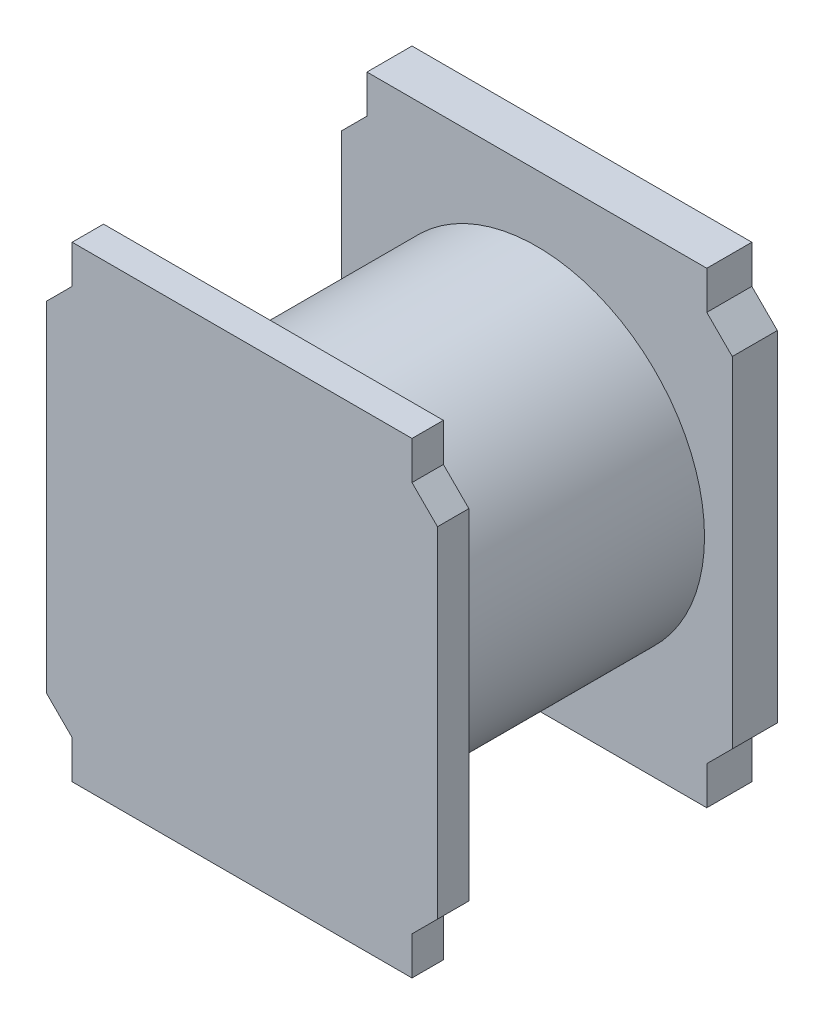
ISO-10303-21;
HEADER;
FILE_DESCRIPTION(('STEP AP214'),'2;1');
FILE_NAME('part.step','',(''),(''),'','','');
FILE_SCHEMA(('AUTOMOTIVE_DESIGN { 1 0 10303 214 1 1 1 1 }'));
ENDSEC;
DATA;
#1=APPLICATION_CONTEXT('core data for automotive mechanical design processes');
#2=APPLICATION_PROTOCOL_DEFINITION('international standard','automotive_design',2000,#1);
#3=PRODUCT_CONTEXT('',#1,'mechanical');
#4=PRODUCT('Part','Part','',(#3));
#5=PRODUCT_RELATED_PRODUCT_CATEGORY('part','',(#4));
#6=PRODUCT_DEFINITION_FORMATION('','',#4);
#7=PRODUCT_DEFINITION_CONTEXT('part definition',#1,'design');
#8=PRODUCT_DEFINITION('design','',#6,#7);
#9=PRODUCT_DEFINITION_SHAPE('','',#8);
#10=(LENGTH_UNIT() NAMED_UNIT(*) SI_UNIT(.MILLI.,.METRE.));
#11=(NAMED_UNIT(*) PLANE_ANGLE_UNIT() SI_UNIT($,.RADIAN.));
#12=(NAMED_UNIT(*) SI_UNIT($,.STERADIAN.) SOLID_ANGLE_UNIT());
#13=UNCERTAINTY_MEASURE_WITH_UNIT(LENGTH_MEASURE(1.E-05),#10,'distance_accuracy_value','');
#14=(GEOMETRIC_REPRESENTATION_CONTEXT(3) GLOBAL_UNCERTAINTY_ASSIGNED_CONTEXT((#13)) GLOBAL_UNIT_ASSIGNED_CONTEXT((#10,
#11,#12)) REPRESENTATION_CONTEXT('',''));
#15=CARTESIAN_POINT('',(0.,0.,0.));
#16=DIRECTION('',(0.,0.,1.));
#17=DIRECTION('',(1.,0.,0.));
#18=AXIS2_PLACEMENT_3D('',#15,#16,#17);
#19=CARTESIAN_POINT('',(0.,0.,4.));
#20=DIRECTION('',(0.,0.,1.));
#21=DIRECTION('',(1.,0.,0.));
#22=AXIS2_PLACEMENT_3D('',#19,#20,#21);
#23=PLANE('',#22);
#24=DIRECTION('',(0.,1.,0.));
#25=VECTOR('',#24,1.);
#26=CARTESIAN_POINT('',(-2.,2.299999999995,4.));
#27=LINE('',#26,#25);
#28=CARTESIAN_POINT('',(-2.,2.299999999995,4.));
#29=VERTEX_POINT('',#28);
#30=CARTESIAN_POINT('',(-2.,2.75,4.));
#31=VERTEX_POINT('',#30);
#32=EDGE_CURVE('E11',#29,#31,#27,.T.);
#33=ORIENTED_EDGE('',*,*,#32,.F.);
#34=DIRECTION('',(0.707106781193048,0.707106781180048,0.));
#35=VECTOR('',#34,1.);
#36=CARTESIAN_POINT('',(-2.3,2.,4.));
#37=LINE('',#36,#35);
#38=CARTESIAN_POINT('',(-2.3,2.,4.));
#39=VERTEX_POINT('',#38);
#40=EDGE_CURVE('E253',#39,#29,#37,.T.);
#41=ORIENTED_EDGE('',*,*,#40,.F.);
#42=DIRECTION('',(0.,1.,0.));
#43=VECTOR('',#42,1.);
#44=CARTESIAN_POINT('',(-2.3,-2.,4.));
#45=LINE('',#44,#43);
#46=CARTESIAN_POINT('',(-2.3,-2.,4.));
#47=VERTEX_POINT('',#46);
#48=EDGE_CURVE('E246',#47,#39,#45,.T.);
#49=ORIENTED_EDGE('',*,*,#48,.F.);
#50=DIRECTION('',(-0.707106781193048,0.707106781180048,0.));
#51=VECTOR('',#50,1.);
#52=CARTESIAN_POINT('',(-2.,-2.299999999995,4.));
#53=LINE('',#52,#51);
#54=CARTESIAN_POINT('',(-2.,-2.299999999995,4.));
#55=VERTEX_POINT('',#54);
#56=EDGE_CURVE('E214',#55,#47,#53,.T.);
#57=ORIENTED_EDGE('',*,*,#56,.F.);
#58=DIRECTION('',(0.,1.,0.));
#59=VECTOR('',#58,1.);
#60=CARTESIAN_POINT('',(-2.,-2.75,4.));
#61=LINE('',#60,#59);
#62=CARTESIAN_POINT('',(-2.,-2.75,4.));
#63=VERTEX_POINT('',#62);
#64=EDGE_CURVE('E208',#63,#55,#61,.T.);
#65=ORIENTED_EDGE('',*,*,#64,.F.);
#66=DIRECTION('',(-1.,0.,0.));
#67=VECTOR('',#66,1.);
#68=CARTESIAN_POINT('',(2.,-2.75,4.));
#69=LINE('',#68,#67);
#70=CARTESIAN_POINT('',(2.,-2.75,4.));
#71=VERTEX_POINT('',#70);
#72=EDGE_CURVE('E211',#71,#63,#69,.T.);
#73=ORIENTED_EDGE('',*,*,#72,.F.);
#74=DIRECTION('',(0.,-1.,0.));
#75=VECTOR('',#74,1.);
#76=CARTESIAN_POINT('',(2.,-2.299999999995,4.));
#77=LINE('',#76,#75);
#78=CARTESIAN_POINT('',(2.,-2.299999999995,4.));
#79=VERTEX_POINT('',#78);
#80=EDGE_CURVE('E238',#79,#71,#77,.T.);
#81=ORIENTED_EDGE('',*,*,#80,.F.);
#82=DIRECTION('',(-0.707106781193048,-0.707106781180048,0.));
#83=VECTOR('',#82,1.);
#84=CARTESIAN_POINT('',(2.3,-2.,4.));
#85=LINE('',#84,#83);
#86=CARTESIAN_POINT('',(2.3,-2.,4.));
#87=VERTEX_POINT('',#86);
#88=EDGE_CURVE('E348',#87,#79,#85,.T.);
#89=ORIENTED_EDGE('',*,*,#88,.F.);
#90=DIRECTION('',(0.,-1.,0.));
#91=VECTOR('',#90,1.);
#92=CARTESIAN_POINT('',(2.3,2.,4.));
#93=LINE('',#92,#91);
#94=CARTESIAN_POINT('',(2.3,2.,4.));
#95=VERTEX_POINT('',#94);
#96=EDGE_CURVE('E340',#95,#87,#93,.T.);
#97=ORIENTED_EDGE('',*,*,#96,.F.);
#98=DIRECTION('',(0.707106781193048,-0.707106781180048,0.));
#99=VECTOR('',#98,1.);
#100=CARTESIAN_POINT('',(2.,2.299999999995,4.));
#101=LINE('',#100,#99);
#102=CARTESIAN_POINT('',(2.,2.299999999995,4.));
#103=VERTEX_POINT('',#102);
#104=EDGE_CURVE('E332',#103,#95,#101,.T.);
#105=ORIENTED_EDGE('',*,*,#104,.F.);
#106=DIRECTION('',(0.,-1.,0.));
#107=VECTOR('',#106,1.);
#108=CARTESIAN_POINT('',(2.,2.75,4.));
#109=LINE('',#108,#107);
#110=CARTESIAN_POINT('',(2.,2.75,4.));
#111=VERTEX_POINT('',#110);
#112=EDGE_CURVE('E371',#111,#103,#109,.T.);
#113=ORIENTED_EDGE('',*,*,#112,.F.);
#114=DIRECTION('',(1.,0.,0.));
#115=VECTOR('',#114,1.);
#116=CARTESIAN_POINT('',(-2.,2.75,4.));
#117=LINE('',#116,#115);
#118=EDGE_CURVE('E329',#31,#111,#117,.T.);
#119=ORIENTED_EDGE('',*,*,#118,.F.);
#120=EDGE_LOOP('',(#33,#41,#49,#57,#65,#73,#81,#89,#97,#105,#113,#119));
#121=FACE_BOUND('',#120,.T.);
#122=ADVANCED_FACE('F17',(#121),#23,.T.);
#123=CARTESIAN_POINT('',(-2.,2.299999999995,0.));
#124=DIRECTION('',(-1.,0.,0.));
#125=DIRECTION('',(0.,0.,1.));
#126=AXIS2_PLACEMENT_3D('',#123,#124,#125);
#127=PLANE('',#126);
#128=DIRECTION('',(0.,1.,0.));
#129=VECTOR('',#128,1.);
#130=CARTESIAN_POINT('',(-2.,1.149999999997,3.630577));
#131=LINE('',#130,#129);
#132=CARTESIAN_POINT('',(-2.,2.299999999995,3.630577));
#133=VERTEX_POINT('',#132);
#134=CARTESIAN_POINT('',(-2.,2.75,3.630577));
#135=VERTEX_POINT('',#134);
#136=EDGE_CURVE('E318',#133,#135,#131,.T.);
#137=ORIENTED_EDGE('',*,*,#136,.F.);
#138=DIRECTION('',(0.,0.,1.));
#139=VECTOR('',#138,1.);
#140=CARTESIAN_POINT('',(-2.,2.299999999995,0.));
#141=LINE('',#140,#139);
#142=EDGE_CURVE('E27',#133,#29,#141,.T.);
#143=ORIENTED_EDGE('',*,*,#142,.T.);
#144=ORIENTED_EDGE('',*,*,#32,.T.);
#145=DIRECTION('',(0.,0.,1.));
#146=VECTOR('',#145,1.);
#147=CARTESIAN_POINT('',(-2.,2.75,0.));
#148=LINE('',#147,#146);
#149=EDGE_CURVE('E326',#135,#31,#148,.T.);
#150=ORIENTED_EDGE('',*,*,#149,.F.);
#151=EDGE_LOOP('',(#137,#143,#144,#150));
#152=FACE_BOUND('',#151,.T.);
#153=ADVANCED_FACE('F569',(#152),#127,.T.);
#154=CARTESIAN_POINT('',(-2.3,2.,0.));
#155=DIRECTION('',(-0.707106781180048,0.707106781193048,0.));
#156=DIRECTION('',(0.,0.,1.));
#157=AXIS2_PLACEMENT_3D('',#154,#155,#156);
#158=PLANE('',#157);
#159=DIRECTION('',(0.707106781193048,0.707106781180048,0.));
#160=VECTOR('',#159,1.);
#161=CARTESIAN_POINT('',(-2.22499999999,2.075000000009,3.630577));
#162=LINE('',#161,#160);
#163=CARTESIAN_POINT('',(-2.3,2.,3.630577));
#164=VERTEX_POINT('',#163);
#165=EDGE_CURVE('E320',#164,#133,#162,.T.);
#166=ORIENTED_EDGE('',*,*,#165,.F.);
#167=DIRECTION('',(0.,0.,1.));
#168=VECTOR('',#167,1.);
#169=CARTESIAN_POINT('',(-2.3,2.,0.));
#170=LINE('',#169,#168);
#171=EDGE_CURVE('E247',#164,#39,#170,.T.);
#172=ORIENTED_EDGE('',*,*,#171,.T.);
#173=ORIENTED_EDGE('',*,*,#40,.T.);
#174=ORIENTED_EDGE('',*,*,#142,.F.);
#175=EDGE_LOOP('',(#166,#172,#173,#174));
#176=FACE_BOUND('',#175,.T.);
#177=ADVANCED_FACE('F575',(#176),#158,.T.);
#178=CARTESIAN_POINT('',(-2.3,-2.,0.));
#179=DIRECTION('',(-1.,0.,0.));
#180=DIRECTION('',(0.,0.,1.));
#181=AXIS2_PLACEMENT_3D('',#178,#179,#180);
#182=PLANE('',#181);
#183=DIRECTION('',(0.,1.,0.));
#184=VECTOR('',#183,1.);
#185=CARTESIAN_POINT('',(-2.3,-1.,3.630577));
#186=LINE('',#185,#184);
#187=CARTESIAN_POINT('',(-2.3,-2.,3.630577));
#188=VERTEX_POINT('',#187);
#189=EDGE_CURVE('E311',#188,#164,#186,.T.);
#190=ORIENTED_EDGE('',*,*,#189,.F.);
#191=DIRECTION('',(0.,0.,1.));
#192=VECTOR('',#191,1.);
#193=CARTESIAN_POINT('',(-2.3,-2.,0.));
#194=LINE('',#193,#192);
#195=EDGE_CURVE('E245',#188,#47,#194,.T.);
#196=ORIENTED_EDGE('',*,*,#195,.T.);
#197=ORIENTED_EDGE('',*,*,#48,.T.);
#198=ORIENTED_EDGE('',*,*,#171,.F.);
#199=EDGE_LOOP('',(#190,#196,#197,#198));
#200=FACE_BOUND('',#199,.T.);
#201=ADVANCED_FACE('F573',(#200),#182,.T.);
#202=CARTESIAN_POINT('',(-2.,-2.299999999995,0.));
#203=DIRECTION('',(-0.707106781180048,-0.707106781193048,0.));
#204=DIRECTION('',(-0.707106781193048,0.707106781180048,0.));
#205=AXIS2_PLACEMENT_3D('',#202,#203,#204);
#206=PLANE('',#205);
#207=DIRECTION('',(-0.707106781193048,0.707106781180048,0.));
#208=VECTOR('',#207,1.);
#209=CARTESIAN_POINT('',(-2.07499999999,-2.225000000006,3.630577));
#210=LINE('',#209,#208);
#211=CARTESIAN_POINT('',(-2.,-2.299999999995,3.630577));
#212=VERTEX_POINT('',#211);
#213=EDGE_CURVE('E310',#212,#188,#210,.T.);
#214=ORIENTED_EDGE('',*,*,#213,.F.);
#215=DIRECTION('',(0.,0.,1.));
#216=VECTOR('',#215,1.);
#217=CARTESIAN_POINT('',(-2.,-2.299999999995,0.));
#218=LINE('',#217,#216);
#219=EDGE_CURVE('E218',#212,#55,#218,.T.);
#220=ORIENTED_EDGE('',*,*,#219,.T.);
#221=ORIENTED_EDGE('',*,*,#56,.T.);
#222=ORIENTED_EDGE('',*,*,#195,.F.);
#223=EDGE_LOOP('',(#214,#220,#221,#222));
#224=FACE_BOUND('',#223,.T.);
#225=ADVANCED_FACE('F563',(#224),#206,.T.);
#226=CARTESIAN_POINT('',(-2.,-2.75,0.));
#227=DIRECTION('',(-1.,0.,0.));
#228=DIRECTION('',(0.,0.,1.));
#229=AXIS2_PLACEMENT_3D('',#226,#227,#228);
#230=PLANE('',#229);
#231=DIRECTION('',(0.,1.,0.));
#232=VECTOR('',#231,1.);
#233=CARTESIAN_POINT('',(-2.,-1.375,3.630577));
#234=LINE('',#233,#232);
#235=CARTESIAN_POINT('',(-2.,-2.75,3.630577));
#236=VERTEX_POINT('',#235);
#237=EDGE_CURVE('E223',#236,#212,#234,.T.);
#238=ORIENTED_EDGE('',*,*,#237,.F.);
#239=DIRECTION('',(0.,0.,1.));
#240=VECTOR('',#239,1.);
#241=CARTESIAN_POINT('',(-2.,-2.75,0.));
#242=LINE('',#241,#240);
#243=EDGE_CURVE('E219',#236,#63,#242,.T.);
#244=ORIENTED_EDGE('',*,*,#243,.T.);
#245=ORIENTED_EDGE('',*,*,#64,.T.);
#246=ORIENTED_EDGE('',*,*,#219,.F.);
#247=EDGE_LOOP('',(#238,#244,#245,#246));
#248=FACE_BOUND('',#247,.T.);
#249=ADVANCED_FACE('F224',(#248),#230,.T.);
#250=CARTESIAN_POINT('',(2.,-2.75,0.));
#251=DIRECTION('',(0.,-1.,0.));
#252=DIRECTION('',(0.,0.,-1.));
#253=AXIS2_PLACEMENT_3D('',#250,#251,#252);
#254=PLANE('',#253);
#255=DIRECTION('',(-1.,0.,0.));
#256=VECTOR('',#255,1.);
#257=CARTESIAN_POINT('',(1.,-2.75,3.630577));
#258=LINE('',#257,#256);
#259=CARTESIAN_POINT('',(2.,-2.75,3.630577));
#260=VERTEX_POINT('',#259);
#261=EDGE_CURVE('E303',#260,#236,#258,.T.);
#262=ORIENTED_EDGE('',*,*,#261,.F.);
#263=DIRECTION('',(0.,0.,1.));
#264=VECTOR('',#263,1.);
#265=CARTESIAN_POINT('',(2.,-2.75,0.));
#266=LINE('',#265,#264);
#267=EDGE_CURVE('E235',#260,#71,#266,.T.);
#268=ORIENTED_EDGE('',*,*,#267,.T.);
#269=ORIENTED_EDGE('',*,*,#72,.T.);
#270=ORIENTED_EDGE('',*,*,#243,.F.);
#271=EDGE_LOOP('',(#262,#268,#269,#270));
#272=FACE_BOUND('',#271,.T.);
#273=ADVANCED_FACE('F231',(#272),#254,.T.);
#274=CARTESIAN_POINT('',(2.,-2.299999999995,0.));
#275=DIRECTION('',(1.,0.,0.));
#276=DIRECTION('',(0.,1.,0.));
#277=AXIS2_PLACEMENT_3D('',#274,#275,#276);
#278=PLANE('',#277);
#279=DIRECTION('',(0.,-1.,0.));
#280=VECTOR('',#279,1.);
#281=CARTESIAN_POINT('',(2.,-1.149999999997,3.630577));
#282=LINE('',#281,#280);
#283=CARTESIAN_POINT('',(2.,-2.299999999995,3.630577));
#284=VERTEX_POINT('',#283);
#285=EDGE_CURVE('E298',#284,#260,#282,.T.);
#286=ORIENTED_EDGE('',*,*,#285,.F.);
#287=DIRECTION('',(0.,0.,1.));
#288=VECTOR('',#287,1.);
#289=CARTESIAN_POINT('',(2.,-2.299999999995,0.));
#290=LINE('',#289,#288);
#291=EDGE_CURVE('E308',#284,#79,#290,.T.);
#292=ORIENTED_EDGE('',*,*,#291,.T.);
#293=ORIENTED_EDGE('',*,*,#80,.T.);
#294=ORIENTED_EDGE('',*,*,#267,.F.);
#295=EDGE_LOOP('',(#286,#292,#293,#294));
#296=FACE_BOUND('',#295,.T.);
#297=ADVANCED_FACE('F356',(#296),#278,.T.);
#298=CARTESIAN_POINT('',(2.3,-2.,0.));
#299=DIRECTION('',(0.707106781180048,-0.707106781193048,0.));
#300=DIRECTION('',(0.,0.,-1.));
#301=AXIS2_PLACEMENT_3D('',#298,#299,#300);
#302=PLANE('',#301);
#303=DIRECTION('',(-0.707106781193048,-0.707106781180048,0.));
#304=VECTOR('',#303,1.);
#305=CARTESIAN_POINT('',(2.22499999999,-2.075000000009,3.630577));
#306=LINE('',#305,#304);
#307=CARTESIAN_POINT('',(2.3,-2.,3.630577));
#308=VERTEX_POINT('',#307);
#309=EDGE_CURVE('E294',#308,#284,#306,.T.);
#310=ORIENTED_EDGE('',*,*,#309,.F.);
#311=DIRECTION('',(0.,0.,1.));
#312=VECTOR('',#311,1.);
#313=CARTESIAN_POINT('',(2.3,-2.,0.));
#314=LINE('',#313,#312);
#315=EDGE_CURVE('E342',#308,#87,#314,.T.);
#316=ORIENTED_EDGE('',*,*,#315,.T.);
#317=ORIENTED_EDGE('',*,*,#88,.T.);
#318=ORIENTED_EDGE('',*,*,#291,.F.);
#319=EDGE_LOOP('',(#310,#316,#317,#318));
#320=FACE_BOUND('',#319,.T.);
#321=ADVANCED_FACE('F357',(#320),#302,.T.);
#322=CARTESIAN_POINT('',(2.3,2.,0.));
#323=DIRECTION('',(1.,0.,0.));
#324=DIRECTION('',(0.,1.,0.));
#325=AXIS2_PLACEMENT_3D('',#322,#323,#324);
#326=PLANE('',#325);
#327=DIRECTION('',(0.,-1.,0.));
#328=VECTOR('',#327,1.);
#329=CARTESIAN_POINT('',(2.3,1.,3.630577));
#330=LINE('',#329,#328);
#331=CARTESIAN_POINT('',(2.3,2.,3.630577));
#332=VERTEX_POINT('',#331);
#333=EDGE_CURVE('E295',#332,#308,#330,.T.);
#334=ORIENTED_EDGE('',*,*,#333,.F.);
#335=DIRECTION('',(0.,0.,1.));
#336=VECTOR('',#335,1.);
#337=CARTESIAN_POINT('',(2.3,2.,0.));
#338=LINE('',#337,#336);
#339=EDGE_CURVE('E333',#332,#95,#338,.T.);
#340=ORIENTED_EDGE('',*,*,#339,.T.);
#341=ORIENTED_EDGE('',*,*,#96,.T.);
#342=ORIENTED_EDGE('',*,*,#315,.F.);
#343=EDGE_LOOP('',(#334,#340,#341,#342));
#344=FACE_BOUND('',#343,.T.);
#345=ADVANCED_FACE('F361',(#344),#326,.T.);
#346=CARTESIAN_POINT('',(2.,2.299999999995,0.));
#347=DIRECTION('',(0.707106781180048,0.707106781193048,0.));
#348=DIRECTION('',(0.,0.,-1.));
#349=AXIS2_PLACEMENT_3D('',#346,#347,#348);
#350=PLANE('',#349);
#351=DIRECTION('',(0.707106781193048,-0.707106781180048,0.));
#352=VECTOR('',#351,1.);
#353=CARTESIAN_POINT('',(2.07499999999,2.225000000006,3.630577));
#354=LINE('',#353,#352);
#355=CARTESIAN_POINT('',(2.,2.299999999995,3.630577));
#356=VERTEX_POINT('',#355);
#357=EDGE_CURVE('E290',#356,#332,#354,.T.);
#358=ORIENTED_EDGE('',*,*,#357,.F.);
#359=DIRECTION('',(0.,0.,1.));
#360=VECTOR('',#359,1.);
#361=CARTESIAN_POINT('',(2.,2.299999999995,0.));
#362=LINE('',#361,#360);
#363=EDGE_CURVE('E336',#356,#103,#362,.T.);
#364=ORIENTED_EDGE('',*,*,#363,.T.);
#365=ORIENTED_EDGE('',*,*,#104,.T.);
#366=ORIENTED_EDGE('',*,*,#339,.F.);
#367=EDGE_LOOP('',(#358,#364,#365,#366));
#368=FACE_BOUND('',#367,.T.);
#369=ADVANCED_FACE('F368',(#368),#350,.T.);
#370=CARTESIAN_POINT('',(2.,2.75,0.));
#371=DIRECTION('',(1.,0.,0.));
#372=DIRECTION('',(0.,1.,0.));
#373=AXIS2_PLACEMENT_3D('',#370,#371,#372);
#374=PLANE('',#373);
#375=DIRECTION('',(0.,-1.,0.));
#376=VECTOR('',#375,1.);
#377=CARTESIAN_POINT('',(2.,1.375,3.630577));
#378=LINE('',#377,#376);
#379=CARTESIAN_POINT('',(2.,2.75,3.630577));
#380=VERTEX_POINT('',#379);
#381=EDGE_CURVE('E284',#380,#356,#378,.T.);
#382=ORIENTED_EDGE('',*,*,#381,.F.);
#383=DIRECTION('',(0.,0.,1.));
#384=VECTOR('',#383,1.);
#385=CARTESIAN_POINT('',(2.,2.75,0.));
#386=LINE('',#385,#384);
#387=EDGE_CURVE('E374',#380,#111,#386,.T.);
#388=ORIENTED_EDGE('',*,*,#387,.T.);
#389=ORIENTED_EDGE('',*,*,#112,.T.);
#390=ORIENTED_EDGE('',*,*,#363,.F.);
#391=EDGE_LOOP('',(#382,#388,#389,#390));
#392=FACE_BOUND('',#391,.T.);
#393=ADVANCED_FACE('F372',(#392),#374,.T.);
#394=CARTESIAN_POINT('',(-2.,2.75,0.));
#395=DIRECTION('',(0.,1.,0.));
#396=DIRECTION('',(1.,0.,0.));
#397=AXIS2_PLACEMENT_3D('',#394,#395,#396);
#398=PLANE('',#397);
#399=DIRECTION('',(1.,0.,0.));
#400=VECTOR('',#399,1.);
#401=CARTESIAN_POINT('',(-1.,2.75,3.630577));
#402=LINE('',#401,#400);
#403=EDGE_CURVE('E325',#135,#380,#402,.T.);
#404=ORIENTED_EDGE('',*,*,#403,.F.);
#405=ORIENTED_EDGE('',*,*,#149,.T.);
#406=ORIENTED_EDGE('',*,*,#118,.T.);
#407=ORIENTED_EDGE('',*,*,#387,.F.);
#408=EDGE_LOOP('',(#404,#405,#406,#407));
#409=FACE_BOUND('',#408,.T.);
#410=ADVANCED_FACE('F567',(#409),#398,.T.);
#411=CARTESIAN_POINT('',(0.,0.,3.630577));
#412=DIRECTION('',(0.,0.,-1.));
#413=DIRECTION('',(0.,-1.,0.));
#414=AXIS2_PLACEMENT_3D('',#411,#412,#413);
#415=PLANE('',#414);
#416=CARTESIAN_POINT('',(0.,0.,3.630577));
#417=DIRECTION('',(0.,0.,1.));
#418=DIRECTION('',(1.,0.,0.));
#419=AXIS2_PLACEMENT_3D('',#416,#417,#418);
#420=CIRCLE('',#419,1.973333);
#421=CARTESIAN_POINT('',(1.973333,0.,3.630577));
#422=VERTEX_POINT('',#421);
#423=EDGE_CURVE('E278',#422,#422,#420,.T.);
#424=ORIENTED_EDGE('',*,*,#423,.T.);
#425=EDGE_LOOP('',(#424));
#426=FACE_BOUND('',#425,.T.);
#427=ORIENTED_EDGE('',*,*,#381,.T.);
#428=ORIENTED_EDGE('',*,*,#357,.T.);
#429=ORIENTED_EDGE('',*,*,#333,.T.);
#430=ORIENTED_EDGE('',*,*,#309,.T.);
#431=ORIENTED_EDGE('',*,*,#285,.T.);
#432=ORIENTED_EDGE('',*,*,#261,.T.);
#433=ORIENTED_EDGE('',*,*,#237,.T.);
#434=ORIENTED_EDGE('',*,*,#213,.T.);
#435=ORIENTED_EDGE('',*,*,#189,.T.);
#436=ORIENTED_EDGE('',*,*,#165,.T.);
#437=ORIENTED_EDGE('',*,*,#136,.T.);
#438=ORIENTED_EDGE('',*,*,#403,.T.);
#439=EDGE_LOOP('',(#427,#428,#429,#430,#431,#432,#433,#434,#435,#436,#437,#438));
#440=FACE_BOUND('',#439,.T.);
#441=ADVANCED_FACE('F570',(#426,#440),#415,.T.);
#442=CARTESIAN_POINT('',(0.,0.,3.630577));
#443=DIRECTION('',(0.,0.,-1.));
#444=DIRECTION('',(1.,0.,0.));
#445=AXIS2_PLACEMENT_3D('',#442,#443,#444);
#446=CYLINDRICAL_SURFACE('',#445,1.973333);
#447=DIRECTION('',(0.,0.,-1.));
#448=VECTOR('',#447,1.);
#449=CARTESIAN_POINT('',(1.973333,0.,3.630577));
#450=LINE('',#449,#448);
#451=CARTESIAN_POINT('',(1.973333,0.,0.530363));
#452=VERTEX_POINT('',#451);
#453=EDGE_CURVE('E277',#422,#452,#450,.T.);
#454=ORIENTED_EDGE('',*,*,#453,.T.);
#455=CARTESIAN_POINT('',(0.,0.,0.530363));
#456=DIRECTION('',(0.,0.,1.));
#457=DIRECTION('',(1.,0.,0.));
#458=AXIS2_PLACEMENT_3D('',#455,#456,#457);
#459=CIRCLE('',#458,1.973333);
#460=EDGE_CURVE('E405',#452,#452,#459,.T.);
#461=ORIENTED_EDGE('',*,*,#460,.T.);
#462=ORIENTED_EDGE('',*,*,#453,.F.);
#463=ORIENTED_EDGE('',*,*,#423,.F.);
#464=EDGE_LOOP('',(#454,#461,#462,#463));
#465=FACE_BOUND('',#464,.T.);
#466=ADVANCED_FACE('F732',(#465),#446,.T.);
#467=CARTESIAN_POINT('',(-2.3,2.,0.));
#468=DIRECTION('',(-0.707106781180048,0.707106781193048,0.));
#469=DIRECTION('',(0.,0.,1.));
#470=AXIS2_PLACEMENT_3D('',#467,#468,#469);
#471=PLANE('',#470);
#472=DIRECTION('',(0.707106781193048,0.707106781180048,0.));
#473=VECTOR('',#472,1.);
#474=CARTESIAN_POINT('',(-2.3,2.,0.));
#475=LINE('',#474,#473);
#476=CARTESIAN_POINT('',(-2.3,2.,0.));
#477=VERTEX_POINT('',#476);
#478=CARTESIAN_POINT('',(-2.,2.299999999995,0.));
#479=VERTEX_POINT('',#478);
#480=EDGE_CURVE('E466',#477,#479,#475,.T.);
#481=ORIENTED_EDGE('',*,*,#480,.F.);
#482=DIRECTION('',(0.,0.,1.));
#483=VECTOR('',#482,1.);
#484=CARTESIAN_POINT('',(-2.3,2.,0.));
#485=LINE('',#484,#483);
#486=CARTESIAN_POINT('',(-2.3,2.,0.530363));
#487=VERTEX_POINT('',#486);
#488=EDGE_CURVE('E275',#477,#487,#485,.T.);
#489=ORIENTED_EDGE('',*,*,#488,.T.);
#490=DIRECTION('',(-0.707106781193048,-0.707106781180048,0.));
#491=VECTOR('',#490,1.);
#492=CARTESIAN_POINT('',(-2.22499999999,2.075000000009,0.530363));
#493=LINE('',#492,#491);
#494=CARTESIAN_POINT('',(-2.,2.299999999995,0.530363));
#495=VERTEX_POINT('',#494);
#496=EDGE_CURVE('E486',#495,#487,#493,.T.);
#497=ORIENTED_EDGE('',*,*,#496,.F.);
#498=DIRECTION('',(0.,0.,1.));
#499=VECTOR('',#498,1.);
#500=CARTESIAN_POINT('',(-2.,2.299999999995,0.));
#501=LINE('',#500,#499);
#502=EDGE_CURVE('E402',#479,#495,#501,.T.);
#503=ORIENTED_EDGE('',*,*,#502,.F.);
#504=EDGE_LOOP('',(#481,#489,#497,#503));
#505=FACE_BOUND('',#504,.T.);
#506=ADVANCED_FACE('F706',(#505),#471,.T.);
#507=CARTESIAN_POINT('',(-2.3,-2.,0.));
#508=DIRECTION('',(-1.,0.,0.));
#509=DIRECTION('',(0.,0.,1.));
#510=AXIS2_PLACEMENT_3D('',#507,#508,#509);
#511=PLANE('',#510);
#512=DIRECTION('',(0.,1.,0.));
#513=VECTOR('',#512,1.);
#514=CARTESIAN_POINT('',(-2.3,-2.,0.));
#515=LINE('',#514,#513);
#516=CARTESIAN_POINT('',(-2.3,-2.,0.));
#517=VERTEX_POINT('',#516);
#518=EDGE_CURVE('E465',#517,#477,#515,.T.);
#519=ORIENTED_EDGE('',*,*,#518,.F.);
#520=DIRECTION('',(0.,0.,1.));
#521=VECTOR('',#520,1.);
#522=CARTESIAN_POINT('',(-2.3,-2.,0.));
#523=LINE('',#522,#521);
#524=CARTESIAN_POINT('',(-2.3,-2.,0.530363));
#525=VERTEX_POINT('',#524);
#526=EDGE_CURVE('E267',#517,#525,#523,.T.);
#527=ORIENTED_EDGE('',*,*,#526,.T.);
#528=DIRECTION('',(0.,-1.,0.));
#529=VECTOR('',#528,1.);
#530=CARTESIAN_POINT('',(-2.3,-1.,0.530363));
#531=LINE('',#530,#529);
#532=EDGE_CURVE('E489',#487,#525,#531,.T.);
#533=ORIENTED_EDGE('',*,*,#532,.F.);
#534=ORIENTED_EDGE('',*,*,#488,.F.);
#535=EDGE_LOOP('',(#519,#527,#533,#534));
#536=FACE_BOUND('',#535,.T.);
#537=ADVANCED_FACE('F707',(#536),#511,.T.);
#538=CARTESIAN_POINT('',(-2.,-2.299999999995,0.));
#539=DIRECTION('',(-0.707106781180048,-0.707106781193048,0.));
#540=DIRECTION('',(-0.707106781193048,0.707106781180048,0.));
#541=AXIS2_PLACEMENT_3D('',#538,#539,#540);
#542=PLANE('',#541);
#543=DIRECTION('',(-0.707106781193048,0.707106781180048,0.));
#544=VECTOR('',#543,1.);
#545=CARTESIAN_POINT('',(-2.,-2.299999999995,0.));
#546=LINE('',#545,#544);
#547=CARTESIAN_POINT('',(-2.,-2.299999999995,0.));
#548=VERTEX_POINT('',#547);
#549=EDGE_CURVE('E457',#548,#517,#546,.T.);
#550=ORIENTED_EDGE('',*,*,#549,.F.);
#551=DIRECTION('',(0.,0.,1.));
#552=VECTOR('',#551,1.);
#553=CARTESIAN_POINT('',(-2.,-2.299999999995,0.));
#554=LINE('',#553,#552);
#555=CARTESIAN_POINT('',(-2.,-2.299999999995,0.530363));
#556=VERTEX_POINT('',#555);
#557=EDGE_CURVE('E272',#548,#556,#554,.T.);
#558=ORIENTED_EDGE('',*,*,#557,.T.);
#559=DIRECTION('',(0.707106781193048,-0.707106781180048,0.));
#560=VECTOR('',#559,1.);
#561=CARTESIAN_POINT('',(-2.07499999999,-2.225000000006,0.530363));
#562=LINE('',#561,#560);
#563=EDGE_CURVE('E493',#525,#556,#562,.T.);
#564=ORIENTED_EDGE('',*,*,#563,.F.);
#565=ORIENTED_EDGE('',*,*,#526,.F.);
#566=EDGE_LOOP('',(#550,#558,#564,#565));
#567=FACE_BOUND('',#566,.T.);
#568=ADVANCED_FACE('F709',(#567),#542,.T.);
#569=CARTESIAN_POINT('',(-2.,-2.75,0.));
#570=DIRECTION('',(-1.,0.,0.));
#571=DIRECTION('',(0.,0.,1.));
#572=AXIS2_PLACEMENT_3D('',#569,#570,#571);
#573=PLANE('',#572);
#574=DIRECTION('',(0.,1.,0.));
#575=VECTOR('',#574,1.);
#576=CARTESIAN_POINT('',(-2.,-2.75,0.));
#577=LINE('',#576,#575);
#578=CARTESIAN_POINT('',(-2.,-2.75,0.));
#579=VERTEX_POINT('',#578);
#580=EDGE_CURVE('E451',#579,#548,#577,.T.);
#581=ORIENTED_EDGE('',*,*,#580,.F.);
#582=DIRECTION('',(0.,0.,1.));
#583=VECTOR('',#582,1.);
#584=CARTESIAN_POINT('',(-2.,-2.75,0.));
#585=LINE('',#584,#583);
#586=CARTESIAN_POINT('',(-2.,-2.75,0.530363));
#587=VERTEX_POINT('',#586);
#588=EDGE_CURVE('E270',#579,#587,#585,.T.);
#589=ORIENTED_EDGE('',*,*,#588,.T.);
#590=DIRECTION('',(0.,-1.,0.));
#591=VECTOR('',#590,1.);
#592=CARTESIAN_POINT('',(-2.,-1.375,0.530363));
#593=LINE('',#592,#591);
#594=EDGE_CURVE('E502',#556,#587,#593,.T.);
#595=ORIENTED_EDGE('',*,*,#594,.F.);
#596=ORIENTED_EDGE('',*,*,#557,.F.);
#597=EDGE_LOOP('',(#581,#589,#595,#596));
#598=FACE_BOUND('',#597,.T.);
#599=ADVANCED_FACE('F711',(#598),#573,.T.);
#600=CARTESIAN_POINT('',(2.,-2.75,0.));
#601=DIRECTION('',(0.,-1.,0.));
#602=DIRECTION('',(0.,0.,-1.));
#603=AXIS2_PLACEMENT_3D('',#600,#601,#602);
#604=PLANE('',#603);
#605=DIRECTION('',(-1.,0.,0.));
#606=VECTOR('',#605,1.);
#607=CARTESIAN_POINT('',(2.,-2.75,0.));
#608=LINE('',#607,#606);
#609=CARTESIAN_POINT('',(2.,-2.75,0.));
#610=VERTEX_POINT('',#609);
#611=EDGE_CURVE('E447',#610,#579,#608,.T.);
#612=ORIENTED_EDGE('',*,*,#611,.F.);
#613=DIRECTION('',(0.,0.,1.));
#614=VECTOR('',#613,1.);
#615=CARTESIAN_POINT('',(2.,-2.75,0.));
#616=LINE('',#615,#614);
#617=CARTESIAN_POINT('',(2.,-2.75,0.530363));
#618=VERTEX_POINT('',#617);
#619=EDGE_CURVE('E412',#610,#618,#616,.T.);
#620=ORIENTED_EDGE('',*,*,#619,.T.);
#621=DIRECTION('',(1.,0.,0.));
#622=VECTOR('',#621,1.);
#623=CARTESIAN_POINT('',(1.,-2.75,0.530363));
#624=LINE('',#623,#622);
#625=EDGE_CURVE('E505',#587,#618,#624,.T.);
#626=ORIENTED_EDGE('',*,*,#625,.F.);
#627=ORIENTED_EDGE('',*,*,#588,.F.);
#628=EDGE_LOOP('',(#612,#620,#626,#627));
#629=FACE_BOUND('',#628,.T.);
#630=ADVANCED_FACE('F713',(#629),#604,.T.);
#631=CARTESIAN_POINT('',(2.,-2.299999999995,0.));
#632=DIRECTION('',(1.,0.,0.));
#633=DIRECTION('',(0.,1.,0.));
#634=AXIS2_PLACEMENT_3D('',#631,#632,#633);
#635=PLANE('',#634);
#636=DIRECTION('',(0.,-1.,0.));
#637=VECTOR('',#636,1.);
#638=CARTESIAN_POINT('',(2.,-2.299999999995,0.));
#639=LINE('',#638,#637);
#640=CARTESIAN_POINT('',(2.,-2.299999999995,0.));
#641=VERTEX_POINT('',#640);
#642=EDGE_CURVE('E455',#641,#610,#639,.T.);
#643=ORIENTED_EDGE('',*,*,#642,.F.);
#644=DIRECTION('',(0.,0.,1.));
#645=VECTOR('',#644,1.);
#646=CARTESIAN_POINT('',(2.,-2.299999999995,0.));
#647=LINE('',#646,#645);
#648=CARTESIAN_POINT('',(2.,-2.299999999995,0.530363));
#649=VERTEX_POINT('',#648);
#650=EDGE_CURVE('E415',#641,#649,#647,.T.);
#651=ORIENTED_EDGE('',*,*,#650,.T.);
#652=DIRECTION('',(0.,1.,0.));
#653=VECTOR('',#652,1.);
#654=CARTESIAN_POINT('',(2.,-1.149999999997,0.530363));
#655=LINE('',#654,#653);
#656=EDGE_CURVE('E387',#618,#649,#655,.T.);
#657=ORIENTED_EDGE('',*,*,#656,.F.);
#658=ORIENTED_EDGE('',*,*,#619,.F.);
#659=EDGE_LOOP('',(#643,#651,#657,#658));
#660=FACE_BOUND('',#659,.T.);
#661=ADVANCED_FACE('F516',(#660),#635,.T.);
#662=CARTESIAN_POINT('',(2.3,-2.,0.));
#663=DIRECTION('',(0.707106781180048,-0.707106781193048,0.));
#664=DIRECTION('',(0.,0.,-1.));
#665=AXIS2_PLACEMENT_3D('',#662,#663,#664);
#666=PLANE('',#665);
#667=DIRECTION('',(-0.707106781193048,-0.707106781180048,0.));
#668=VECTOR('',#667,1.);
#669=CARTESIAN_POINT('',(2.3,-2.,0.));
#670=LINE('',#669,#668);
#671=CARTESIAN_POINT('',(2.3,-2.,0.));
#672=VERTEX_POINT('',#671);
#673=EDGE_CURVE('E446',#672,#641,#670,.T.);
#674=ORIENTED_EDGE('',*,*,#673,.F.);
#675=DIRECTION('',(0.,0.,1.));
#676=VECTOR('',#675,1.);
#677=CARTESIAN_POINT('',(2.3,-2.,0.));
#678=LINE('',#677,#676);
#679=CARTESIAN_POINT('',(2.3,-2.,0.530363));
#680=VERTEX_POINT('',#679);
#681=EDGE_CURVE('E411',#672,#680,#678,.T.);
#682=ORIENTED_EDGE('',*,*,#681,.T.);
#683=DIRECTION('',(0.707106781193048,0.707106781180048,0.));
#684=VECTOR('',#683,1.);
#685=CARTESIAN_POINT('',(2.22499999999,-2.075000000009,0.530363));
#686=LINE('',#685,#684);
#687=EDGE_CURVE('E388',#649,#680,#686,.T.);
#688=ORIENTED_EDGE('',*,*,#687,.F.);
#689=ORIENTED_EDGE('',*,*,#650,.F.);
#690=EDGE_LOOP('',(#674,#682,#688,#689));
#691=FACE_BOUND('',#690,.T.);
#692=ADVANCED_FACE('F521',(#691),#666,.T.);
#693=CARTESIAN_POINT('',(2.3,2.,0.));
#694=DIRECTION('',(1.,0.,0.));
#695=DIRECTION('',(0.,1.,0.));
#696=AXIS2_PLACEMENT_3D('',#693,#694,#695);
#697=PLANE('',#696);
#698=DIRECTION('',(0.,-1.,0.));
#699=VECTOR('',#698,1.);
#700=CARTESIAN_POINT('',(2.3,2.,0.));
#701=LINE('',#700,#699);
#702=CARTESIAN_POINT('',(2.3,2.,0.));
#703=VERTEX_POINT('',#702);
#704=EDGE_CURVE('E442',#703,#672,#701,.T.);
#705=ORIENTED_EDGE('',*,*,#704,.F.);
#706=DIRECTION('',(0.,0.,1.));
#707=VECTOR('',#706,1.);
#708=CARTESIAN_POINT('',(2.3,2.,0.));
#709=LINE('',#708,#707);
#710=CARTESIAN_POINT('',(2.3,2.,0.530363));
#711=VERTEX_POINT('',#710);
#712=EDGE_CURVE('E407',#703,#711,#709,.T.);
#713=ORIENTED_EDGE('',*,*,#712,.T.);
#714=DIRECTION('',(0.,1.,0.));
#715=VECTOR('',#714,1.);
#716=CARTESIAN_POINT('',(2.3,1.,0.530363));
#717=LINE('',#716,#715);
#718=EDGE_CURVE('E393',#680,#711,#717,.T.);
#719=ORIENTED_EDGE('',*,*,#718,.F.);
#720=ORIENTED_EDGE('',*,*,#681,.F.);
#721=EDGE_LOOP('',(#705,#713,#719,#720));
#722=FACE_BOUND('',#721,.T.);
#723=ADVANCED_FACE('F524',(#722),#697,.T.);
#724=CARTESIAN_POINT('',(2.,2.299999999995,0.));
#725=DIRECTION('',(0.707106781180048,0.707106781193048,0.));
#726=DIRECTION('',(0.,0.,-1.));
#727=AXIS2_PLACEMENT_3D('',#724,#725,#726);
#728=PLANE('',#727);
#729=DIRECTION('',(0.707106781193048,-0.707106781180048,0.));
#730=VECTOR('',#729,1.);
#731=CARTESIAN_POINT('',(2.,2.299999999995,0.));
#732=LINE('',#731,#730);
#733=CARTESIAN_POINT('',(2.,2.299999999995,0.));
#734=VERTEX_POINT('',#733);
#735=EDGE_CURVE('E437',#734,#703,#732,.T.);
#736=ORIENTED_EDGE('',*,*,#735,.F.);
#737=DIRECTION('',(0.,0.,1.));
#738=VECTOR('',#737,1.);
#739=CARTESIAN_POINT('',(2.,2.299999999995,0.));
#740=LINE('',#739,#738);
#741=CARTESIAN_POINT('',(2.,2.299999999995,0.530363));
#742=VERTEX_POINT('',#741);
#743=EDGE_CURVE('E471',#734,#742,#740,.T.);
#744=ORIENTED_EDGE('',*,*,#743,.T.);
#745=DIRECTION('',(-0.707106781193048,0.707106781180048,0.));
#746=VECTOR('',#745,1.);
#747=CARTESIAN_POINT('',(2.07499999999,2.225000000006,0.530363));
#748=LINE('',#747,#746);
#749=EDGE_CURVE('E400',#711,#742,#748,.T.);
#750=ORIENTED_EDGE('',*,*,#749,.F.);
#751=ORIENTED_EDGE('',*,*,#712,.F.);
#752=EDGE_LOOP('',(#736,#744,#750,#751));
#753=FACE_BOUND('',#752,.T.);
#754=ADVANCED_FACE('F535',(#753),#728,.T.);
#755=CARTESIAN_POINT('',(-2.,2.299999999995,0.));
#756=DIRECTION('',(-1.,0.,0.));
#757=DIRECTION('',(0.,0.,1.));
#758=AXIS2_PLACEMENT_3D('',#755,#756,#757);
#759=PLANE('',#758);
#760=DIRECTION('',(0.,1.,0.));
#761=VECTOR('',#760,1.);
#762=CARTESIAN_POINT('',(-2.,2.299999999995,0.));
#763=LINE('',#762,#761);
#764=CARTESIAN_POINT('',(-2.,2.75,0.));
#765=VERTEX_POINT('',#764);
#766=EDGE_CURVE('E436',#479,#765,#763,.T.);
#767=ORIENTED_EDGE('',*,*,#766,.F.);
#768=ORIENTED_EDGE('',*,*,#502,.T.);
#769=DIRECTION('',(0.,-1.,0.));
#770=VECTOR('',#769,1.);
#771=CARTESIAN_POINT('',(-2.,1.149999999997,0.530363));
#772=LINE('',#771,#770);
#773=CARTESIAN_POINT('',(-2.,2.75,0.530363));
#774=VERTEX_POINT('',#773);
#775=EDGE_CURVE('E477',#774,#495,#772,.T.);
#776=ORIENTED_EDGE('',*,*,#775,.F.);
#777=DIRECTION('',(0.,0.,1.));
#778=VECTOR('',#777,1.);
#779=CARTESIAN_POINT('',(-2.,2.75,0.));
#780=LINE('',#779,#778);
#781=EDGE_CURVE('E549',#765,#774,#780,.T.);
#782=ORIENTED_EDGE('',*,*,#781,.F.);
#783=EDGE_LOOP('',(#767,#768,#776,#782));
#784=FACE_BOUND('',#783,.T.);
#785=ADVANCED_FACE('F701',(#784),#759,.T.);
#786=CARTESIAN_POINT('',(0.,0.,0.530363));
#787=DIRECTION('',(0.,0.,1.));
#788=DIRECTION('',(1.,0.,0.));
#789=AXIS2_PLACEMENT_3D('',#786,#787,#788);
#790=PLANE('',#789);
#791=ORIENTED_EDGE('',*,*,#460,.F.);
#792=EDGE_LOOP('',(#791));
#793=FACE_BOUND('',#792,.T.);
#794=ORIENTED_EDGE('',*,*,#775,.T.);
#795=ORIENTED_EDGE('',*,*,#496,.T.);
#796=ORIENTED_EDGE('',*,*,#532,.T.);
#797=ORIENTED_EDGE('',*,*,#563,.T.);
#798=ORIENTED_EDGE('',*,*,#594,.T.);
#799=ORIENTED_EDGE('',*,*,#625,.T.);
#800=ORIENTED_EDGE('',*,*,#656,.T.);
#801=ORIENTED_EDGE('',*,*,#687,.T.);
#802=ORIENTED_EDGE('',*,*,#718,.T.);
#803=ORIENTED_EDGE('',*,*,#749,.T.);
#804=DIRECTION('',(0.,1.,0.));
#805=VECTOR('',#804,1.);
#806=CARTESIAN_POINT('',(2.,1.375,0.530363));
#807=LINE('',#806,#805);
#808=CARTESIAN_POINT('',(2.,2.75,0.530363));
#809=VERTEX_POINT('',#808);
#810=EDGE_CURVE('E469',#742,#809,#807,.T.);
#811=ORIENTED_EDGE('',*,*,#810,.T.);
#812=DIRECTION('',(-1.,0.,0.));
#813=VECTOR('',#812,1.);
#814=CARTESIAN_POINT('',(-1.,2.75,0.530363));
#815=LINE('',#814,#813);
#816=EDGE_CURVE('E544',#809,#774,#815,.T.);
#817=ORIENTED_EDGE('',*,*,#816,.T.);
#818=EDGE_LOOP('',(#794,#795,#796,#797,#798,#799,#800,#801,#802,#803,#811,#817));
#819=FACE_BOUND('',#818,.T.);
#820=ADVANCED_FACE('F511',(#793,#819),#790,.T.);
#821=CARTESIAN_POINT('',(2.,2.75,0.));
#822=DIRECTION('',(1.,0.,0.));
#823=DIRECTION('',(0.,1.,0.));
#824=AXIS2_PLACEMENT_3D('',#821,#822,#823);
#825=PLANE('',#824);
#826=DIRECTION('',(0.,-1.,0.));
#827=VECTOR('',#826,1.);
#828=CARTESIAN_POINT('',(2.,2.75,0.));
#829=LINE('',#828,#827);
#830=CARTESIAN_POINT('',(2.,2.75,0.));
#831=VERTEX_POINT('',#830);
#832=EDGE_CURVE('E445',#831,#734,#829,.T.);
#833=ORIENTED_EDGE('',*,*,#832,.F.);
#834=DIRECTION('',(0.,0.,1.));
#835=VECTOR('',#834,1.);
#836=CARTESIAN_POINT('',(2.,2.75,0.));
#837=LINE('',#836,#835);
#838=EDGE_CURVE('E538',#831,#809,#837,.T.);
#839=ORIENTED_EDGE('',*,*,#838,.T.);
#840=ORIENTED_EDGE('',*,*,#810,.F.);
#841=ORIENTED_EDGE('',*,*,#743,.F.);
#842=EDGE_LOOP('',(#833,#839,#840,#841));
#843=FACE_BOUND('',#842,.T.);
#844=ADVANCED_FACE('F536',(#843),#825,.T.);
#845=CARTESIAN_POINT('',(0.,0.,0.));
#846=DIRECTION('',(0.,0.,1.));
#847=DIRECTION('',(1.,0.,0.));
#848=AXIS2_PLACEMENT_3D('',#845,#846,#847);
#849=PLANE('',#848);
#850=DIRECTION('',(1.,0.,0.));
#851=VECTOR('',#850,1.);
#852=CARTESIAN_POINT('',(-2.,2.75,0.));
#853=LINE('',#852,#851);
#854=EDGE_CURVE('E556',#765,#831,#853,.T.);
#855=ORIENTED_EDGE('',*,*,#854,.T.);
#856=ORIENTED_EDGE('',*,*,#832,.T.);
#857=ORIENTED_EDGE('',*,*,#735,.T.);
#858=ORIENTED_EDGE('',*,*,#704,.T.);
#859=ORIENTED_EDGE('',*,*,#673,.T.);
#860=ORIENTED_EDGE('',*,*,#642,.T.);
#861=ORIENTED_EDGE('',*,*,#611,.T.);
#862=ORIENTED_EDGE('',*,*,#580,.T.);
#863=ORIENTED_EDGE('',*,*,#549,.T.);
#864=ORIENTED_EDGE('',*,*,#518,.T.);
#865=ORIENTED_EDGE('',*,*,#480,.T.);
#866=ORIENTED_EDGE('',*,*,#766,.T.);
#867=EDGE_LOOP('',(#855,#856,#857,#858,#859,#860,#861,#862,#863,#864,#865,#866));
#868=FACE_BOUND('',#867,.T.);
#869=ADVANCED_FACE('F712',(#868),#849,.F.);
#870=CARTESIAN_POINT('',(-2.,2.75,0.));
#871=DIRECTION('',(0.,1.,0.));
#872=DIRECTION('',(1.,0.,0.));
#873=AXIS2_PLACEMENT_3D('',#870,#871,#872);
#874=PLANE('',#873);
#875=ORIENTED_EDGE('',*,*,#854,.F.);
#876=ORIENTED_EDGE('',*,*,#781,.T.);
#877=ORIENTED_EDGE('',*,*,#816,.F.);
#878=ORIENTED_EDGE('',*,*,#838,.F.);
#879=EDGE_LOOP('',(#875,#876,#877,#878));
#880=FACE_BOUND('',#879,.T.);
#881=ADVANCED_FACE('F547',(#880),#874,.T.);
#882=CLOSED_SHELL('',(#122,#153,#177,#201,#225,#249,#273,#297,#321,#345,#369,#393,#410,#441,
#466,#506,#537,#568,#599,#630,#661,#692,#723,#754,#785,#820,#844,#869,#881));
#883=MANIFOLD_SOLID_BREP('B1',#882);
#884=ADVANCED_BREP_SHAPE_REPRESENTATION('',(#18,#883),#14);
#885=SHAPE_DEFINITION_REPRESENTATION(#9,#884);
ENDSEC;
END-ISO-10303-21;
